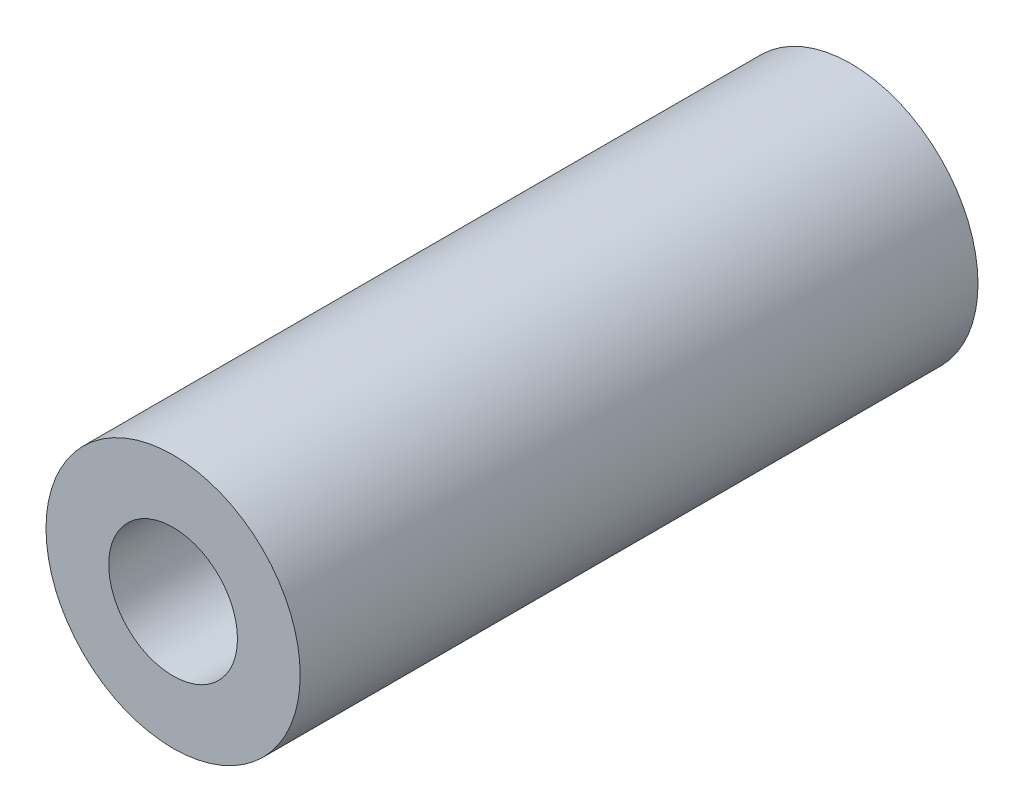
ISO-10303-21;
HEADER;
FILE_DESCRIPTION(('STEP AP214'),'2;1');
FILE_NAME('part.step','',(''),(''),'','','');
FILE_SCHEMA(('AUTOMOTIVE_DESIGN { 1 0 10303 214 1 1 1 1 }'));
ENDSEC;
DATA;
#1=APPLICATION_CONTEXT('core data for automotive mechanical design processes');
#2=APPLICATION_PROTOCOL_DEFINITION('international standard','automotive_design',2000,#1);
#3=PRODUCT_CONTEXT('',#1,'mechanical');
#4=PRODUCT('Part','Part','',(#3));
#5=PRODUCT_RELATED_PRODUCT_CATEGORY('part','',(#4));
#6=PRODUCT_DEFINITION_FORMATION('','',#4);
#7=PRODUCT_DEFINITION_CONTEXT('part definition',#1,'design');
#8=PRODUCT_DEFINITION('design','',#6,#7);
#9=PRODUCT_DEFINITION_SHAPE('','',#8);
#10=(LENGTH_UNIT() NAMED_UNIT(*) SI_UNIT(.MILLI.,.METRE.));
#11=(NAMED_UNIT(*) PLANE_ANGLE_UNIT() SI_UNIT($,.RADIAN.));
#12=(NAMED_UNIT(*) SI_UNIT($,.STERADIAN.) SOLID_ANGLE_UNIT());
#13=UNCERTAINTY_MEASURE_WITH_UNIT(LENGTH_MEASURE(1.E-05),#10,'distance_accuracy_value','');
#14=(GEOMETRIC_REPRESENTATION_CONTEXT(3) GLOBAL_UNCERTAINTY_ASSIGNED_CONTEXT((#13)) GLOBAL_UNIT_ASSIGNED_CONTEXT((#10,
#11,#12)) REPRESENTATION_CONTEXT('',''));
#15=CARTESIAN_POINT('',(0.,0.,0.));
#16=DIRECTION('',(0.,0.,1.));
#17=DIRECTION('',(1.,0.,0.));
#18=AXIS2_PLACEMENT_3D('',#15,#16,#17);
#19=CARTESIAN_POINT('',(0.,0.,50.8));
#20=DIRECTION('',(0.,0.,1.));
#21=DIRECTION('',(1.,0.,0.));
#22=AXIS2_PLACEMENT_3D('',#19,#20,#21);
#23=PLANE('',#22);
#24=CARTESIAN_POINT('',(0.,0.,50.8));
#25=DIRECTION('',(0.,0.,1.));
#26=DIRECTION('',(1.,0.,0.));
#27=AXIS2_PLACEMENT_3D('',#24,#25,#26);
#28=CIRCLE('',#27,9.525);
#29=CARTESIAN_POINT('',(9.525,0.,50.8));
#30=VERTEX_POINT('',#29);
#31=EDGE_CURVE('E10',#30,#30,#28,.T.);
#32=ORIENTED_EDGE('',*,*,#31,.T.);
#33=EDGE_LOOP('',(#32));
#34=FACE_BOUND('',#33,.T.);
#35=CARTESIAN_POINT('',(0.,0.,50.8));
#36=DIRECTION('',(0.,0.,1.));
#37=DIRECTION('',(1.,0.,0.));
#38=AXIS2_PLACEMENT_3D('',#35,#36,#37);
#39=CIRCLE('',#38,4.826);
#40=CARTESIAN_POINT('',(4.826,0.,50.8));
#41=VERTEX_POINT('',#40);
#42=EDGE_CURVE('E42',#41,#41,#39,.T.);
#43=ORIENTED_EDGE('',*,*,#42,.F.);
#44=EDGE_LOOP('',(#43));
#45=FACE_BOUND('',#44,.T.);
#46=ADVANCED_FACE('F31',(#34,#45),#23,.T.);
#47=CARTESIAN_POINT('',(0.,0.,0.));
#48=DIRECTION('',(0.,0.,1.));
#49=DIRECTION('',(1.,0.,0.));
#50=AXIS2_PLACEMENT_3D('',#47,#48,#49);
#51=PLANE('',#50);
#52=CARTESIAN_POINT('',(0.,0.,0.));
#53=DIRECTION('',(0.,0.,1.));
#54=DIRECTION('',(1.,0.,0.));
#55=AXIS2_PLACEMENT_3D('',#52,#53,#54);
#56=CIRCLE('',#55,9.525);
#57=CARTESIAN_POINT('',(9.525,0.,0.));
#58=VERTEX_POINT('',#57);
#59=EDGE_CURVE('E35',#58,#58,#56,.T.);
#60=ORIENTED_EDGE('',*,*,#59,.F.);
#61=EDGE_LOOP('',(#60));
#62=FACE_BOUND('',#61,.T.);
#63=CARTESIAN_POINT('',(0.,0.,0.));
#64=DIRECTION('',(0.,0.,1.));
#65=DIRECTION('',(1.,0.,0.));
#66=AXIS2_PLACEMENT_3D('',#63,#64,#65);
#67=CIRCLE('',#66,4.826);
#68=CARTESIAN_POINT('',(4.826,0.,0.));
#69=VERTEX_POINT('',#68);
#70=EDGE_CURVE('E44',#69,#69,#67,.T.);
#71=ORIENTED_EDGE('',*,*,#70,.T.);
#72=EDGE_LOOP('',(#71));
#73=FACE_BOUND('',#72,.T.);
#74=ADVANCED_FACE('F54',(#62,#73),#51,.F.);
#75=CARTESIAN_POINT('',(0.,0.,50.8));
#76=DIRECTION('',(0.,0.,-1.));
#77=DIRECTION('',(-1.,0.,0.));
#78=AXIS2_PLACEMENT_3D('',#75,#76,#77);
#79=CYLINDRICAL_SURFACE('',#78,9.525);
#80=ORIENTED_EDGE('',*,*,#31,.F.);
#81=EDGE_LOOP('',(#80));
#82=FACE_BOUND('',#81,.T.);
#83=ORIENTED_EDGE('',*,*,#59,.T.);
#84=EDGE_LOOP('',(#83));
#85=FACE_BOUND('',#84,.T.);
#86=ADVANCED_FACE('F33',(#82,#85),#79,.T.);
#87=CARTESIAN_POINT('',(0.,0.,50.8));
#88=DIRECTION('',(0.,0.,-1.));
#89=DIRECTION('',(-1.,0.,0.));
#90=AXIS2_PLACEMENT_3D('',#87,#88,#89);
#91=CYLINDRICAL_SURFACE('',#90,4.826);
#92=ORIENTED_EDGE('',*,*,#42,.T.);
#93=EDGE_LOOP('',(#92));
#94=FACE_BOUND('',#93,.T.);
#95=ORIENTED_EDGE('',*,*,#70,.F.);
#96=EDGE_LOOP('',(#95));
#97=FACE_BOUND('',#96,.T.);
#98=ADVANCED_FACE('F50',(#94,#97),#91,.F.);
#99=CLOSED_SHELL('',(#46,#74,#86,#98));
#100=MANIFOLD_SOLID_BREP('B2',#99);
#101=ADVANCED_BREP_SHAPE_REPRESENTATION('',(#18,#100),#14);
#102=SHAPE_DEFINITION_REPRESENTATION(#9,#101);
ENDSEC;
END-ISO-10303-21;
